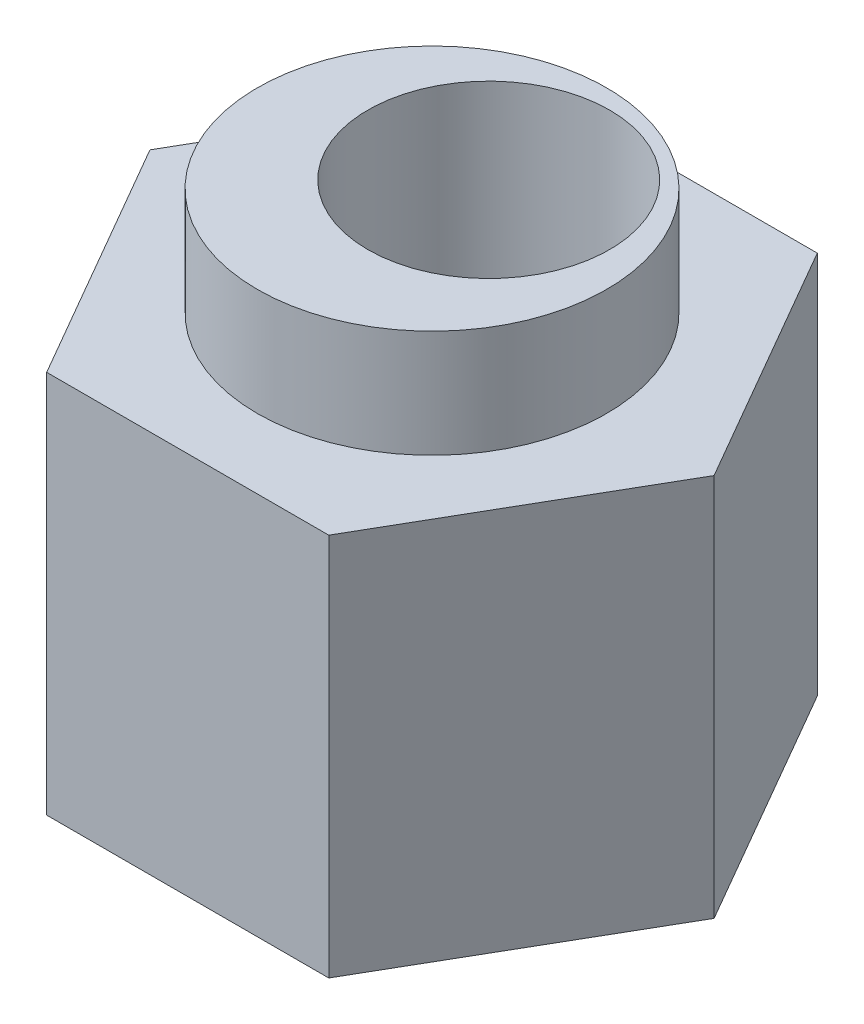
ISO-10303-21;
HEADER;
FILE_DESCRIPTION(('STEP AP214'),'2;1');
FILE_NAME('part.step','',(''),(''),'','','');
FILE_SCHEMA(('AUTOMOTIVE_DESIGN { 1 0 10303 214 1 1 1 1 }'));
ENDSEC;
DATA;
#1=APPLICATION_CONTEXT('core data for automotive mechanical design processes');
#2=APPLICATION_PROTOCOL_DEFINITION('international standard','automotive_design',2000,#1);
#3=PRODUCT_CONTEXT('',#1,'mechanical');
#4=PRODUCT('Part','Part','',(#3));
#5=PRODUCT_RELATED_PRODUCT_CATEGORY('part','',(#4));
#6=PRODUCT_DEFINITION_FORMATION('','',#4);
#7=PRODUCT_DEFINITION_CONTEXT('part definition',#1,'design');
#8=PRODUCT_DEFINITION('design','',#6,#7);
#9=PRODUCT_DEFINITION_SHAPE('','',#8);
#10=(LENGTH_UNIT() NAMED_UNIT(*) SI_UNIT(.MILLI.,.METRE.));
#11=(NAMED_UNIT(*) PLANE_ANGLE_UNIT() SI_UNIT($,.RADIAN.));
#12=(NAMED_UNIT(*) SI_UNIT($,.STERADIAN.) SOLID_ANGLE_UNIT());
#13=UNCERTAINTY_MEASURE_WITH_UNIT(LENGTH_MEASURE(1.E-05),#10,'distance_accuracy_value','');
#14=(GEOMETRIC_REPRESENTATION_CONTEXT(3) GLOBAL_UNCERTAINTY_ASSIGNED_CONTEXT((#13)) GLOBAL_UNIT_ASSIGNED_CONTEXT((#10,
#11,#12)) REPRESENTATION_CONTEXT('',''));
#15=CARTESIAN_POINT('',(0.,0.,0.));
#16=DIRECTION('',(0.,0.,1.));
#17=DIRECTION('',(1.,0.,0.));
#18=AXIS2_PLACEMENT_3D('',#15,#16,#17);
#19=CARTESIAN_POINT('',(0.,-3.925,0.));
#20=DIRECTION('',(0.,1.,0.));
#21=DIRECTION('',(0.,0.,1.));
#22=AXIS2_PLACEMENT_3D('',#19,#20,#21);
#23=PLANE('',#22);
#24=DIRECTION('',(-0.5,0.,-0.866025403784438));
#25=VECTOR('',#24,1.);
#26=CARTESIAN_POINT('',(5.77350269189626,-3.925,0.));
#27=LINE('',#26,#25);
#28=CARTESIAN_POINT('',(5.77350269189626,-3.925,0.));
#29=VERTEX_POINT('',#28);
#30=CARTESIAN_POINT('',(2.88675134594813,-3.925,-5.));
#31=VERTEX_POINT('',#30);
#32=EDGE_CURVE('E118',#29,#31,#27,.T.);
#33=ORIENTED_EDGE('',*,*,#32,.F.);
#34=DIRECTION('',(0.5,0.,-0.866025403784439));
#35=VECTOR('',#34,1.);
#36=CARTESIAN_POINT('',(2.88675134594813,-3.925,5.));
#37=LINE('',#36,#35);
#38=CARTESIAN_POINT('',(2.88675134594813,-3.925,5.));
#39=VERTEX_POINT('',#38);
#40=EDGE_CURVE('E78',#39,#29,#37,.T.);
#41=ORIENTED_EDGE('',*,*,#40,.F.);
#42=DIRECTION('',(1.,0.,0.));
#43=VECTOR('',#42,1.);
#44=CARTESIAN_POINT('',(-2.88675134594812,-3.925,5.));
#45=LINE('',#44,#43);
#46=CARTESIAN_POINT('',(-2.88675134594812,-3.925,5.));
#47=VERTEX_POINT('',#46);
#48=EDGE_CURVE('E72',#47,#39,#45,.T.);
#49=ORIENTED_EDGE('',*,*,#48,.F.);
#50=DIRECTION('',(0.5,0.,0.866025403784438));
#51=VECTOR('',#50,1.);
#52=CARTESIAN_POINT('',(-5.77350269189625,-3.925,0.));
#53=LINE('',#52,#51);
#54=CARTESIAN_POINT('',(-5.77350269189625,-3.925,0.));
#55=VERTEX_POINT('',#54);
#56=EDGE_CURVE('E108',#55,#47,#53,.T.);
#57=ORIENTED_EDGE('',*,*,#56,.F.);
#58=DIRECTION('',(-0.5,0.,0.866025403784439));
#59=VECTOR('',#58,1.);
#60=CARTESIAN_POINT('',(-2.88675134594813,-3.925,-5.));
#61=LINE('',#60,#59);
#62=CARTESIAN_POINT('',(-2.88675134594813,-3.925,-5.));
#63=VERTEX_POINT('',#62);
#64=EDGE_CURVE('E124',#63,#55,#61,.T.);
#65=ORIENTED_EDGE('',*,*,#64,.F.);
#66=DIRECTION('',(-1.,0.,0.));
#67=VECTOR('',#66,1.);
#68=CARTESIAN_POINT('',(2.88675134594813,-3.925,-5.));
#69=LINE('',#68,#67);
#70=EDGE_CURVE('E121',#31,#63,#69,.T.);
#71=ORIENTED_EDGE('',*,*,#70,.F.);
#72=EDGE_LOOP('',(#33,#41,#49,#57,#65,#71));
#73=FACE_BOUND('',#72,.T.);
#74=CARTESIAN_POINT('',(0.425,-3.925,-0.736121593216773));
#75=DIRECTION('',(0.,1.,0.));
#76=DIRECTION('',(0.,0.,1.));
#77=AXIS2_PLACEMENT_3D('',#74,#75,#76);
#78=CIRCLE('',#77,3.5);
#79=CARTESIAN_POINT('',(0.425,-3.925,2.76387840678323));
#80=VERTEX_POINT('',#79);
#81=EDGE_CURVE('E11',#80,#80,#78,.F.);
#82=ORIENTED_EDGE('',*,*,#81,.F.);
#83=EDGE_LOOP('',(#82));
#84=FACE_BOUND('',#83,.T.);
#85=ADVANCED_FACE('F32',(#73,#84),#23,.F.);
#86=CARTESIAN_POINT('',(5.77350269189626,3.925,0.));
#87=DIRECTION('',(-0.866025403784438,0.,0.5));
#88=DIRECTION('',(0.5,0.,0.866025403784439));
#89=AXIS2_PLACEMENT_3D('',#86,#87,#88);
#90=PLANE('',#89);
#91=ORIENTED_EDGE('',*,*,#32,.T.);
#92=DIRECTION('',(0.,-1.,0.));
#93=VECTOR('',#92,1.);
#94=CARTESIAN_POINT('',(2.88675134594813,3.925,-5.));
#95=LINE('',#94,#93);
#96=CARTESIAN_POINT('',(2.88675134594813,3.925,-5.));
#97=VERTEX_POINT('',#96);
#98=EDGE_CURVE('E135',#97,#31,#95,.T.);
#99=ORIENTED_EDGE('',*,*,#98,.F.);
#100=DIRECTION('',(-0.5,0.,-0.866025403784438));
#101=VECTOR('',#100,1.);
#102=CARTESIAN_POINT('',(5.77350269189626,3.925,0.));
#103=LINE('',#102,#101);
#104=CARTESIAN_POINT('',(5.77350269189626,3.925,0.));
#105=VERTEX_POINT('',#104);
#106=EDGE_CURVE('E129',#105,#97,#103,.T.);
#107=ORIENTED_EDGE('',*,*,#106,.F.);
#108=DIRECTION('',(0.,-1.,0.));
#109=VECTOR('',#108,1.);
#110=CARTESIAN_POINT('',(5.77350269189626,3.925,0.));
#111=LINE('',#110,#109);
#112=EDGE_CURVE('E114',#105,#29,#111,.T.);
#113=ORIENTED_EDGE('',*,*,#112,.T.);
#114=EDGE_LOOP('',(#91,#99,#107,#113));
#115=FACE_BOUND('',#114,.T.);
#116=ADVANCED_FACE('F34',(#115),#90,.F.);
#117=CARTESIAN_POINT('',(2.88675134594813,3.925,-5.));
#118=DIRECTION('',(0.,0.,1.));
#119=DIRECTION('',(1.,0.,0.));
#120=AXIS2_PLACEMENT_3D('',#117,#118,#119);
#121=PLANE('',#120);
#122=ORIENTED_EDGE('',*,*,#70,.T.);
#123=DIRECTION('',(0.,-1.,0.));
#124=VECTOR('',#123,1.);
#125=CARTESIAN_POINT('',(-2.88675134594813,3.925,-5.));
#126=LINE('',#125,#124);
#127=CARTESIAN_POINT('',(-2.88675134594813,3.925,-5.));
#128=VERTEX_POINT('',#127);
#129=EDGE_CURVE('E133',#128,#63,#126,.T.);
#130=ORIENTED_EDGE('',*,*,#129,.F.);
#131=DIRECTION('',(-1.,0.,0.));
#132=VECTOR('',#131,1.);
#133=CARTESIAN_POINT('',(2.88675134594813,3.925,-5.));
#134=LINE('',#133,#132);
#135=EDGE_CURVE('E87',#97,#128,#134,.T.);
#136=ORIENTED_EDGE('',*,*,#135,.F.);
#137=ORIENTED_EDGE('',*,*,#98,.T.);
#138=EDGE_LOOP('',(#122,#130,#136,#137));
#139=FACE_BOUND('',#138,.T.);
#140=ADVANCED_FACE('F146',(#139),#121,.F.);
#141=CARTESIAN_POINT('',(-2.88675134594813,3.925,-5.));
#142=DIRECTION('',(0.866025403784439,0.,0.5));
#143=DIRECTION('',(0.5,0.,-0.866025403784439));
#144=AXIS2_PLACEMENT_3D('',#141,#142,#143);
#145=PLANE('',#144);
#146=ORIENTED_EDGE('',*,*,#64,.T.);
#147=DIRECTION('',(0.,-1.,0.));
#148=VECTOR('',#147,1.);
#149=CARTESIAN_POINT('',(-5.77350269189625,3.925,0.));
#150=LINE('',#149,#148);
#151=CARTESIAN_POINT('',(-5.77350269189625,3.925,0.));
#152=VERTEX_POINT('',#151);
#153=EDGE_CURVE('E109',#152,#55,#150,.T.);
#154=ORIENTED_EDGE('',*,*,#153,.F.);
#155=DIRECTION('',(-0.5,0.,0.866025403784439));
#156=VECTOR('',#155,1.);
#157=CARTESIAN_POINT('',(-2.88675134594813,3.925,-5.));
#158=LINE('',#157,#156);
#159=EDGE_CURVE('E100',#128,#152,#158,.T.);
#160=ORIENTED_EDGE('',*,*,#159,.F.);
#161=ORIENTED_EDGE('',*,*,#129,.T.);
#162=EDGE_LOOP('',(#146,#154,#160,#161));
#163=FACE_BOUND('',#162,.T.);
#164=ADVANCED_FACE('F149',(#163),#145,.F.);
#165=CARTESIAN_POINT('',(-5.77350269189625,3.925,0.));
#166=DIRECTION('',(0.866025403784438,0.,-0.5));
#167=DIRECTION('',(-0.5,0.,-0.866025403784439));
#168=AXIS2_PLACEMENT_3D('',#165,#166,#167);
#169=PLANE('',#168);
#170=ORIENTED_EDGE('',*,*,#56,.T.);
#171=DIRECTION('',(0.,-1.,0.));
#172=VECTOR('',#171,1.);
#173=CARTESIAN_POINT('',(-2.88675134594812,3.925,5.));
#174=LINE('',#173,#172);
#175=CARTESIAN_POINT('',(-2.88675134594812,3.925,5.));
#176=VERTEX_POINT('',#175);
#177=EDGE_CURVE('E105',#176,#47,#174,.T.);
#178=ORIENTED_EDGE('',*,*,#177,.F.);
#179=DIRECTION('',(0.5,0.,0.866025403784438));
#180=VECTOR('',#179,1.);
#181=CARTESIAN_POINT('',(-5.77350269189625,3.925,0.));
#182=LINE('',#181,#180);
#183=EDGE_CURVE('E94',#152,#176,#182,.T.);
#184=ORIENTED_EDGE('',*,*,#183,.F.);
#185=ORIENTED_EDGE('',*,*,#153,.T.);
#186=EDGE_LOOP('',(#170,#178,#184,#185));
#187=FACE_BOUND('',#186,.T.);
#188=ADVANCED_FACE('F106',(#187),#169,.F.);
#189=CARTESIAN_POINT('',(-2.88675134594812,3.925,5.));
#190=DIRECTION('',(0.,0.,-1.));
#191=DIRECTION('',(-1.,0.,0.));
#192=AXIS2_PLACEMENT_3D('',#189,#190,#191);
#193=PLANE('',#192);
#194=ORIENTED_EDGE('',*,*,#48,.T.);
#195=DIRECTION('',(0.,-1.,0.));
#196=VECTOR('',#195,1.);
#197=CARTESIAN_POINT('',(2.88675134594813,3.925,5.));
#198=LINE('',#197,#196);
#199=CARTESIAN_POINT('',(2.88675134594813,3.925,5.));
#200=VERTEX_POINT('',#199);
#201=EDGE_CURVE('E110',#200,#39,#198,.T.);
#202=ORIENTED_EDGE('',*,*,#201,.F.);
#203=DIRECTION('',(1.,0.,0.));
#204=VECTOR('',#203,1.);
#205=CARTESIAN_POINT('',(-2.88675134594812,3.925,5.));
#206=LINE('',#205,#204);
#207=EDGE_CURVE('E98',#176,#200,#206,.T.);
#208=ORIENTED_EDGE('',*,*,#207,.F.);
#209=ORIENTED_EDGE('',*,*,#177,.T.);
#210=EDGE_LOOP('',(#194,#202,#208,#209));
#211=FACE_BOUND('',#210,.T.);
#212=ADVANCED_FACE('F112',(#211),#193,.F.);
#213=CARTESIAN_POINT('',(2.88675134594813,3.925,5.));
#214=DIRECTION('',(-0.866025403784439,0.,-0.5));
#215=DIRECTION('',(-0.5,0.,0.866025403784439));
#216=AXIS2_PLACEMENT_3D('',#213,#214,#215);
#217=PLANE('',#216);
#218=ORIENTED_EDGE('',*,*,#40,.T.);
#219=ORIENTED_EDGE('',*,*,#112,.F.);
#220=DIRECTION('',(0.5,0.,-0.866025403784439));
#221=VECTOR('',#220,1.);
#222=CARTESIAN_POINT('',(2.88675134594813,3.925,5.));
#223=LINE('',#222,#221);
#224=EDGE_CURVE('E49',#200,#105,#223,.T.);
#225=ORIENTED_EDGE('',*,*,#224,.F.);
#226=ORIENTED_EDGE('',*,*,#201,.T.);
#227=EDGE_LOOP('',(#218,#219,#225,#226));
#228=FACE_BOUND('',#227,.T.);
#229=ADVANCED_FACE('F154',(#228),#217,.F.);
#230=CARTESIAN_POINT('',(0.,3.925,0.));
#231=DIRECTION('',(0.,1.,0.));
#232=DIRECTION('',(0.,0.,1.));
#233=AXIS2_PLACEMENT_3D('',#230,#231,#232);
#234=PLANE('',#233);
#235=CARTESIAN_POINT('',(0.,3.925,0.));
#236=DIRECTION('',(0.,1.,0.));
#237=DIRECTION('',(0.,0.,1.));
#238=AXIS2_PLACEMENT_3D('',#235,#236,#237);
#239=CIRCLE('',#238,3.575);
#240=CARTESIAN_POINT('',(0.,3.925,3.575));
#241=VERTEX_POINT('',#240);
#242=EDGE_CURVE('E41',#241,#241,#239,.T.);
#243=ORIENTED_EDGE('',*,*,#242,.F.);
#244=EDGE_LOOP('',(#243));
#245=FACE_BOUND('',#244,.T.);
#246=ORIENTED_EDGE('',*,*,#106,.T.);
#247=ORIENTED_EDGE('',*,*,#135,.T.);
#248=ORIENTED_EDGE('',*,*,#159,.T.);
#249=ORIENTED_EDGE('',*,*,#183,.T.);
#250=ORIENTED_EDGE('',*,*,#207,.T.);
#251=ORIENTED_EDGE('',*,*,#224,.T.);
#252=EDGE_LOOP('',(#246,#247,#248,#249,#250,#251));
#253=FACE_BOUND('',#252,.T.);
#254=ADVANCED_FACE('F96',(#245,#253),#234,.T.);
#255=CARTESIAN_POINT('',(0.,6.125,0.));
#256=DIRECTION('',(0.,-1.,0.));
#257=DIRECTION('',(0.,0.,-1.));
#258=AXIS2_PLACEMENT_3D('',#255,#256,#257);
#259=CYLINDRICAL_SURFACE('',#258,3.575);
#260=CARTESIAN_POINT('',(0.,6.125,0.));
#261=DIRECTION('',(0.,1.,0.));
#262=DIRECTION('',(0.,0.,1.));
#263=AXIS2_PLACEMENT_3D('',#260,#261,#262);
#264=CIRCLE('',#263,3.575);
#265=CARTESIAN_POINT('',(0.,6.125,3.575));
#266=VERTEX_POINT('',#265);
#267=EDGE_CURVE('E122',#266,#266,#264,.T.);
#268=ORIENTED_EDGE('',*,*,#267,.F.);
#269=EDGE_LOOP('',(#268));
#270=FACE_BOUND('',#269,.T.);
#271=ORIENTED_EDGE('',*,*,#242,.T.);
#272=EDGE_LOOP('',(#271));
#273=FACE_BOUND('',#272,.T.);
#274=ADVANCED_FACE('F161',(#270,#273),#259,.T.);
#275=CARTESIAN_POINT('',(0.,6.125,0.));
#276=DIRECTION('',(0.,1.,0.));
#277=DIRECTION('',(0.,0.,1.));
#278=AXIS2_PLACEMENT_3D('',#275,#276,#277);
#279=PLANE('',#278);
#280=CARTESIAN_POINT('',(0.425,6.125,-0.736121593216773));
#281=DIRECTION('',(0.,1.,0.));
#282=DIRECTION('',(0.,0.,1.));
#283=AXIS2_PLACEMENT_3D('',#280,#281,#282);
#284=CIRCLE('',#283,2.475);
#285=CARTESIAN_POINT('',(0.425,6.125,1.73887840678323));
#286=VERTEX_POINT('',#285);
#287=EDGE_CURVE('E200',#286,#286,#284,.T.);
#288=ORIENTED_EDGE('',*,*,#287,.F.);
#289=EDGE_LOOP('',(#288));
#290=FACE_BOUND('',#289,.T.);
#291=ORIENTED_EDGE('',*,*,#267,.T.);
#292=EDGE_LOOP('',(#291));
#293=FACE_BOUND('',#292,.T.);
#294=ADVANCED_FACE('F173',(#290,#293),#279,.T.);
#295=CARTESIAN_POINT('',(0.425,-3.925,-0.736121593216773));
#296=DIRECTION('',(0.,1.,0.));
#297=DIRECTION('',(0.,0.,1.));
#298=AXIS2_PLACEMENT_3D('',#295,#296,#297);
#299=CYLINDRICAL_SURFACE('',#298,2.475);
#300=ORIENTED_EDGE('',*,*,#287,.T.);
#301=EDGE_LOOP('',(#300));
#302=FACE_BOUND('',#301,.T.);
#303=CARTESIAN_POINT('',(0.425,-4.425,-0.736121593216773));
#304=DIRECTION('',(0.,-1.,0.));
#305=DIRECTION('',(0.,0.,-1.));
#306=AXIS2_PLACEMENT_3D('',#303,#304,#305);
#307=CIRCLE('',#306,2.475);
#308=CARTESIAN_POINT('',(0.425,-4.425,-3.21112159321677));
#309=VERTEX_POINT('',#308);
#310=EDGE_CURVE('E197',#309,#309,#307,.T.);
#311=ORIENTED_EDGE('',*,*,#310,.T.);
#312=EDGE_LOOP('',(#311));
#313=FACE_BOUND('',#312,.T.);
#314=ADVANCED_FACE('F177',(#302,#313),#299,.F.);
#315=CARTESIAN_POINT('',(0.425,-4.425,-0.736121593216773));
#316=DIRECTION('',(0.,-1.,0.));
#317=DIRECTION('',(0.,0.,-1.));
#318=AXIS2_PLACEMENT_3D('',#315,#316,#317);
#319=PLANE('',#318);
#320=CARTESIAN_POINT('',(0.425,-4.425,-0.736121593216773));
#321=DIRECTION('',(0.,-1.,0.));
#322=DIRECTION('',(0.,0.,-1.));
#323=AXIS2_PLACEMENT_3D('',#320,#321,#322);
#324=CIRCLE('',#323,3.5);
#325=CARTESIAN_POINT('',(0.425,-4.425,-4.23612159321677));
#326=VERTEX_POINT('',#325);
#327=EDGE_CURVE('E194',#326,#326,#324,.T.);
#328=ORIENTED_EDGE('',*,*,#327,.T.);
#329=EDGE_LOOP('',(#328));
#330=FACE_BOUND('',#329,.T.);
#331=ORIENTED_EDGE('',*,*,#310,.F.);
#332=EDGE_LOOP('',(#331));
#333=FACE_BOUND('',#332,.T.);
#334=ADVANCED_FACE('F181',(#330,#333),#319,.T.);
#335=CARTESIAN_POINT('',(0.425,-4.425,-0.736121593216773));
#336=DIRECTION('',(0.,1.,0.));
#337=DIRECTION('',(0.,0.,1.));
#338=AXIS2_PLACEMENT_3D('',#335,#336,#337);
#339=CYLINDRICAL_SURFACE('',#338,3.5);
#340=ORIENTED_EDGE('',*,*,#327,.F.);
#341=EDGE_LOOP('',(#340));
#342=FACE_BOUND('',#341,.T.);
#343=ORIENTED_EDGE('',*,*,#81,.T.);
#344=EDGE_LOOP('',(#343));
#345=FACE_BOUND('',#344,.T.);
#346=ADVANCED_FACE('F183',(#342,#345),#339,.T.);
#347=CLOSED_SHELL('',(#85,#116,#140,#164,#188,#212,#229,#254,#274,#294,#314,#334,#346));
#348=MANIFOLD_SOLID_BREP('B2',#347);
#349=ADVANCED_BREP_SHAPE_REPRESENTATION('',(#18,#348),#14);
#350=SHAPE_DEFINITION_REPRESENTATION(#9,#349);
ENDSEC;
END-ISO-10303-21;
